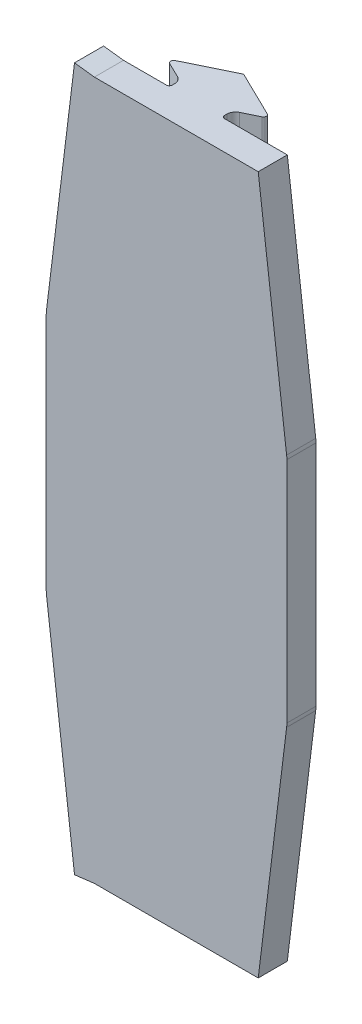
ISO-10303-21;
HEADER;
FILE_DESCRIPTION(('STEP AP214'),'2;1');
FILE_NAME('part.step','',(''),(''),'','','');
FILE_SCHEMA(('AUTOMOTIVE_DESIGN { 1 0 10303 214 1 1 1 1 }'));
ENDSEC;
DATA;
#1=APPLICATION_CONTEXT('core data for automotive mechanical design processes');
#2=APPLICATION_PROTOCOL_DEFINITION('international standard','automotive_design',2000,#1);
#3=PRODUCT_CONTEXT('',#1,'mechanical');
#4=PRODUCT('Part','Part','',(#3));
#5=PRODUCT_RELATED_PRODUCT_CATEGORY('part','',(#4));
#6=PRODUCT_DEFINITION_FORMATION('','',#4);
#7=PRODUCT_DEFINITION_CONTEXT('part definition',#1,'design');
#8=PRODUCT_DEFINITION('design','',#6,#7);
#9=PRODUCT_DEFINITION_SHAPE('','',#8);
#10=(LENGTH_UNIT() NAMED_UNIT(*) SI_UNIT(.MILLI.,.METRE.));
#11=(NAMED_UNIT(*) PLANE_ANGLE_UNIT() SI_UNIT($,.RADIAN.));
#12=(NAMED_UNIT(*) SI_UNIT($,.STERADIAN.) SOLID_ANGLE_UNIT());
#13=UNCERTAINTY_MEASURE_WITH_UNIT(LENGTH_MEASURE(1.E-05),#10,'distance_accuracy_value','');
#14=(GEOMETRIC_REPRESENTATION_CONTEXT(3) GLOBAL_UNCERTAINTY_ASSIGNED_CONTEXT((#13)) GLOBAL_UNIT_ASSIGNED_CONTEXT((#10,
#11,#12)) REPRESENTATION_CONTEXT('',''));
#15=CARTESIAN_POINT('',(0.,0.,0.));
#16=DIRECTION('',(0.,0.,1.));
#17=DIRECTION('',(1.,0.,0.));
#18=AXIS2_PLACEMENT_3D('',#15,#16,#17);
#19=CARTESIAN_POINT('',(-2.10000000000003,24.,3.81226741143411));
#20=DIRECTION('',(0.,1.,0.));
#21=DIRECTION('',(1.,0.,0.));
#22=AXIS2_PLACEMENT_3D('',#19,#20,#21);
#23=PLANE('',#22);
#24=DIRECTION('',(-1.,0.,0.));
#25=VECTOR('',#24,1.);
#26=CARTESIAN_POINT('',(4.20850400580181,24.,5.57546517713166));
#27=LINE('',#26,#25);
#28=CARTESIAN_POINT('',(-4.1,24.,5.57546517713171));
#29=VERTEX_POINT('',#28);
#30=CARTESIAN_POINT('',(-7.05317053833031,24.,5.57546517713172));
#31=VERTEX_POINT('',#30);
#32=EDGE_CURVE('E389',#29,#31,#27,.T.);
#33=ORIENTED_EDGE('',*,*,#32,.T.);
#34=DIRECTION('',(0.,0.,1.));
#35=VECTOR('',#34,1.);
#36=CARTESIAN_POINT('',(-7.05317053833031,24.,5.57546517713172));
#37=LINE('',#36,#35);
#38=CARTESIAN_POINT('',(-7.0531705383303,24.,7.57546517713172));
#39=VERTEX_POINT('',#38);
#40=EDGE_CURVE('E27',#31,#39,#37,.T.);
#41=ORIENTED_EDGE('',*,*,#40,.T.);
#42=DIRECTION('',(-1.,0.,0.));
#43=VECTOR('',#42,1.);
#44=CARTESIAN_POINT('',(4.20850400580182,24.,7.57546517713166));
#45=LINE('',#44,#43);
#46=CARTESIAN_POINT('',(4.20850400580182,24.,7.57546517713166));
#47=VERTEX_POINT('',#46);
#48=EDGE_CURVE('E11',#47,#39,#45,.T.);
#49=ORIENTED_EDGE('',*,*,#48,.F.);
#50=DIRECTION('',(0.,0.,1.));
#51=VECTOR('',#50,1.);
#52=CARTESIAN_POINT('',(4.20850400580181,24.,5.57546517713166));
#53=LINE('',#52,#51);
#54=CARTESIAN_POINT('',(4.20850400580181,24.,5.57546517713166));
#55=VERTEX_POINT('',#54);
#56=EDGE_CURVE('E255',#55,#47,#53,.T.);
#57=ORIENTED_EDGE('',*,*,#56,.F.);
#58=DIRECTION('',(-1.,0.,0.));
#59=VECTOR('',#58,1.);
#60=CARTESIAN_POINT('',(-1.20000000000003,24.,5.5754651771317));
#61=LINE('',#60,#59);
#62=CARTESIAN_POINT('',(-0.100000000000027,24.,5.5754651771317));
#63=VERTEX_POINT('',#62);
#64=EDGE_CURVE('E269',#55,#63,#61,.T.);
#65=ORIENTED_EDGE('',*,*,#64,.T.);
#66=CARTESIAN_POINT('',(-0.100000000000028,24.,5.37546517713168));
#67=DIRECTION('',(0.,1.,0.));
#68=DIRECTION('',(-0.707106781186545,0.,0.70710678118655));
#69=AXIS2_PLACEMENT_3D('',#66,#67,#68);
#70=CIRCLE('',#69,0.2);
#71=CARTESIAN_POINT('',(-0.300000000000028,24.,5.37546517713168));
#72=VERTEX_POINT('',#71);
#73=EDGE_CURVE('E459',#72,#63,#70,.T.);
#74=ORIENTED_EDGE('',*,*,#73,.F.);
#75=DIRECTION('',(0.,0.,-1.));
#76=VECTOR('',#75,1.);
#77=CARTESIAN_POINT('',(-0.30000000000003,24.,4.51884016466477));
#78=LINE('',#77,#76);
#79=CARTESIAN_POINT('',(-0.300000000000028,24.,5.22541291789543));
#80=VERTEX_POINT('',#79);
#81=EDGE_CURVE('E426',#72,#80,#78,.T.);
#82=ORIENTED_EDGE('',*,*,#81,.T.);
#83=CARTESIAN_POINT('',(0.299999999999972,24.,5.22541291789543));
#84=DIRECTION('',(0.,-1.,0.));
#85=DIRECTION('',(-1.,0.,0.));
#86=AXIS2_PLACEMENT_3D('',#83,#84,#85);
#87=CIRCLE('',#86,0.6);
#88=CARTESIAN_POINT('',(0.036977311926528,24.,4.68613649011593));
#89=VERTEX_POINT('',#88);
#90=EDGE_CURVE('E289',#80,#89,#87,.T.);
#91=ORIENTED_EDGE('',*,*,#90,.T.);
#92=DIRECTION('',(0.898794046299169,0.,-0.438371146789073));
#93=VECTOR('',#92,1.);
#94=CARTESIAN_POINT('',(-0.134912057218582,24.,4.76997253707602));
#95=LINE('',#94,#93);
#96=CARTESIAN_POINT('',(1.07520541627584,24.,4.17975880925981));
#97=VERTEX_POINT('',#96);
#98=EDGE_CURVE('E385',#89,#97,#95,.T.);
#99=ORIENTED_EDGE('',*,*,#98,.T.);
#100=CARTESIAN_POINT('',(0.987531186918028,24.,4.));
#101=DIRECTION('',(0.,1.,0.));
#102=DIRECTION('',(0.438371146789087,0.,-0.898794046299162));
#103=AXIS2_PLACEMENT_3D('',#100,#101,#102);
#104=CIRCLE('',#103,0.2);
#105=CARTESIAN_POINT('',(1.07520541627585,24.,3.82024119074015));
#106=VERTEX_POINT('',#105);
#107=EDGE_CURVE('E360',#97,#106,#104,.T.);
#108=ORIENTED_EDGE('',*,*,#107,.T.);
#109=DIRECTION('',(-0.898794046299165,0.,-0.438371146789081));
#110=VECTOR('',#109,1.);
#111=CARTESIAN_POINT('',(-1.79648241465268,24.,2.41962545140828));
#112=LINE('',#111,#110);
#113=CARTESIAN_POINT('',(-2.10000000000004,24.,2.27159003383155));
#114=VERTEX_POINT('',#113);
#115=EDGE_CURVE('E356',#106,#114,#112,.T.);
#116=ORIENTED_EDGE('',*,*,#115,.T.);
#117=DIRECTION('',(-0.898794046299163,0.,0.438371146789086));
#118=VECTOR('',#117,1.);
#119=CARTESIAN_POINT('',(-3.99112029348533,24.,3.19395102986258));
#120=LINE('',#119,#118);
#121=CARTESIAN_POINT('',(-5.27520541627591,24.,3.82024119074016));
#122=VERTEX_POINT('',#121);
#123=EDGE_CURVE('E344',#114,#122,#120,.T.);
#124=ORIENTED_EDGE('',*,*,#123,.T.);
#125=CARTESIAN_POINT('',(-5.18753118691809,24.,4.));
#126=DIRECTION('',(0.,1.,0.));
#127=DIRECTION('',(-0.438371146789068,0.,0.898794046299172));
#128=AXIS2_PLACEMENT_3D('',#125,#126,#127);
#129=CIRCLE('',#128,0.2);
#130=CARTESIAN_POINT('',(-5.2752054162759,24.,4.17975880925983));
#131=VERTEX_POINT('',#130);
#132=EDGE_CURVE('E326',#122,#131,#129,.T.);
#133=ORIENTED_EDGE('',*,*,#132,.T.);
#134=DIRECTION('',(0.89879404629917,0.,0.438371146789071));
#135=VECTOR('',#134,1.);
#136=CARTESIAN_POINT('',(-3.54597389060682,24.,5.02316137750409));
#137=LINE('',#136,#135);
#138=CARTESIAN_POINT('',(-4.23697731192659,24.,4.68613649011594));
#139=VERTEX_POINT('',#138);
#140=EDGE_CURVE('E318',#131,#139,#137,.T.);
#141=ORIENTED_EDGE('',*,*,#140,.T.);
#142=CARTESIAN_POINT('',(-4.5,24.,5.22541291789544));
#143=DIRECTION('',(0.,-1.,0.));
#144=DIRECTION('',(0.438371146789072,0.,-0.89879404629917));
#145=AXIS2_PLACEMENT_3D('',#142,#143,#144);
#146=CIRCLE('',#145,0.6);
#147=CARTESIAN_POINT('',(-3.9,24.,5.22541291789544));
#148=VERTEX_POINT('',#147);
#149=EDGE_CURVE('E308',#139,#148,#146,.T.);
#150=ORIENTED_EDGE('',*,*,#149,.T.);
#151=DIRECTION('',(0.,0.,1.));
#152=VECTOR('',#151,1.);
#153=CARTESIAN_POINT('',(-3.9,24.,4.69386629428291));
#154=LINE('',#153,#152);
#155=CARTESIAN_POINT('',(-3.9,24.,5.37546517713171));
#156=VERTEX_POINT('',#155);
#157=EDGE_CURVE('E290',#148,#156,#154,.T.);
#158=ORIENTED_EDGE('',*,*,#157,.T.);
#159=CARTESIAN_POINT('',(-4.1,24.,5.37546517713171));
#160=DIRECTION('',(0.,1.,0.));
#161=DIRECTION('',(0.707106781186548,0.,0.707106781186548));
#162=AXIS2_PLACEMENT_3D('',#159,#160,#161);
#163=CIRCLE('',#162,0.2);
#164=EDGE_CURVE('E414',#29,#156,#163,.T.);
#165=ORIENTED_EDGE('',*,*,#164,.F.);
#166=EDGE_LOOP('',(#33,#41,#49,#57,#65,#74,#82,#91,#99,#108,#116,#124,#133,#141,#150,#158,#165));
#167=FACE_BOUND('',#166,.T.);
#168=ADVANCED_FACE('F17',(#167),#23,.T.);
#169=CARTESIAN_POINT('',(-2.1,0.,7.5754651771317));
#170=DIRECTION('',(0.,0.,1.));
#171=DIRECTION('',(1.,0.,0.));
#172=AXIS2_PLACEMENT_3D('',#169,#170,#171);
#173=PLANE('',#172);
#174=DIRECTION('',(-0.992546151641321,0.121869343405153,0.));
#175=VECTOR('',#174,1.);
#176=CARTESIAN_POINT('',(-7.0531705383303,24.,7.57546517713172));
#177=LINE('',#176,#175);
#178=CARTESIAN_POINT('',(-8.4194472193632,24.1677576823526,7.57546517713173));
#179=VERTEX_POINT('',#178);
#180=EDGE_CURVE('E187',#39,#179,#177,.T.);
#181=ORIENTED_EDGE('',*,*,#180,.T.);
#182=DIRECTION('',(-0.121869343405147,-0.992546151641322,0.));
#183=VECTOR('',#182,1.);
#184=CARTESIAN_POINT('',(-8.4194472193632,24.1677576823526,7.57546517713173));
#185=LINE('',#184,#183);
#186=CARTESIAN_POINT('',(-10.3290074392395,8.61563772660064,7.57546517713174));
#187=VERTEX_POINT('',#186);
#188=EDGE_CURVE('E20',#179,#187,#185,.T.);
#189=ORIENTED_EDGE('',*,*,#188,.T.);
#190=CARTESIAN_POINT('',(-3.99999999999904,7.83853332722232,7.57546517713171));
#191=DIRECTION('',(0.,0.,1.));
#192=DIRECTION('',(-0.992546151641323,0.121869343405142,0.));
#193=AXIS2_PLACEMENT_3D('',#190,#191,#192);
#194=CIRCLE('',#193,6.37653718043691);
#195=CARTESIAN_POINT('',(-10.376537180436,7.8385333272224,7.57546517713174));
#196=VERTEX_POINT('',#195);
#197=EDGE_CURVE('E184',#187,#196,#194,.T.);
#198=ORIENTED_EDGE('',*,*,#197,.T.);
#199=DIRECTION('',(0.,-1.,0.));
#200=VECTOR('',#199,1.);
#201=CARTESIAN_POINT('',(-10.376537180436,7.8385333272224,7.57546517713174));
#202=LINE('',#201,#200);
#203=CARTESIAN_POINT('',(-10.376537180436,-7.83853332722238,7.57546517713174));
#204=VERTEX_POINT('',#203);
#205=EDGE_CURVE('E212',#196,#204,#202,.T.);
#206=ORIENTED_EDGE('',*,*,#205,.T.);
#207=CARTESIAN_POINT('',(-4.00000000000044,-7.83853332722241,7.57546517713171));
#208=DIRECTION('',(0.,0.,1.));
#209=DIRECTION('',(-1.,0.,0.));
#210=AXIS2_PLACEMENT_3D('',#207,#208,#209);
#211=CIRCLE('',#210,6.37653718043552);
#212=CARTESIAN_POINT('',(-10.3290074392395,-8.61563772660061,7.57546517713174));
#213=VERTEX_POINT('',#212);
#214=EDGE_CURVE('E221',#204,#213,#211,.T.);
#215=ORIENTED_EDGE('',*,*,#214,.T.);
#216=DIRECTION('',(0.121869343405148,-0.992546151641322,0.));
#217=VECTOR('',#216,1.);
#218=CARTESIAN_POINT('',(-10.3290074392395,-8.61563772660062,7.57546517713174));
#219=LINE('',#218,#217);
#220=CARTESIAN_POINT('',(-8.4194472193632,-24.1677576823526,7.57546517713173));
#221=VERTEX_POINT('',#220);
#222=EDGE_CURVE('E222',#213,#221,#219,.T.);
#223=ORIENTED_EDGE('',*,*,#222,.T.);
#224=DIRECTION('',(0.992546151641322,0.121869343405146,0.));
#225=VECTOR('',#224,1.);
#226=CARTESIAN_POINT('',(-8.4194472193632,-24.1677576823526,7.57546517713173));
#227=LINE('',#226,#225);
#228=CARTESIAN_POINT('',(-7.0531705383303,-24.,7.57546517713172));
#229=VERTEX_POINT('',#228);
#230=EDGE_CURVE('E228',#221,#229,#227,.T.);
#231=ORIENTED_EDGE('',*,*,#230,.T.);
#232=DIRECTION('',(1.,0.,0.));
#233=VECTOR('',#232,1.);
#234=CARTESIAN_POINT('',(-7.0531705383303,-24.,7.57546517713172));
#235=LINE('',#234,#233);
#236=CARTESIAN_POINT('',(4.20850400580179,-24.,7.57546517713166));
#237=VERTEX_POINT('',#236);
#238=EDGE_CURVE('E275',#229,#237,#235,.T.);
#239=ORIENTED_EDGE('',*,*,#238,.T.);
#240=DIRECTION('',(0.121869343405148,0.992546151641322,0.));
#241=VECTOR('',#240,1.);
#242=CARTESIAN_POINT('',(4.20850400580179,-24.,7.57546517713166));
#243=LINE('',#242,#241);
#244=CARTESIAN_POINT('',(6.16031360234597,-8.10378648429901,7.57546517713165));
#245=VERTEX_POINT('',#244);
#246=EDGE_CURVE('E231',#237,#245,#243,.T.);
#247=ORIENTED_EDGE('',*,*,#246,.T.);
#248=CARTESIAN_POINT('',(4.00000000000007,-7.83853332722238,7.57546517713166));
#249=DIRECTION('',(0.,0.,1.));
#250=DIRECTION('',(0.992546151641321,-0.121869343405155,0.));
#251=AXIS2_PLACEMENT_3D('',#248,#249,#250);
#252=CIRCLE('',#251,2.17653718043589);
#253=CARTESIAN_POINT('',(6.17653718043596,-7.83853332722238,7.57546517713165));
#254=VERTEX_POINT('',#253);
#255=EDGE_CURVE('E232',#245,#254,#252,.T.);
#256=ORIENTED_EDGE('',*,*,#255,.T.);
#257=DIRECTION('',(0.,1.,0.));
#258=VECTOR('',#257,1.);
#259=CARTESIAN_POINT('',(6.17653718043596,-7.83853332722238,7.57546517713165));
#260=LINE('',#259,#258);
#261=CARTESIAN_POINT('',(6.17653718043597,7.83853332722239,7.57546517713165));
#262=VERTEX_POINT('',#261);
#263=EDGE_CURVE('E240',#254,#262,#260,.T.);
#264=ORIENTED_EDGE('',*,*,#263,.T.);
#265=CARTESIAN_POINT('',(4.,7.83853332722239,7.57546517713166));
#266=DIRECTION('',(0.,0.,1.));
#267=DIRECTION('',(1.,0.,0.));
#268=AXIS2_PLACEMENT_3D('',#265,#266,#267);
#269=CIRCLE('',#268,2.17653718043596);
#270=CARTESIAN_POINT('',(6.16031360234597,8.10378648429902,7.57546517713165));
#271=VERTEX_POINT('',#270);
#272=EDGE_CURVE('E247',#262,#271,#269,.T.);
#273=ORIENTED_EDGE('',*,*,#272,.T.);
#274=DIRECTION('',(-0.121869343405148,0.992546151641322,0.));
#275=VECTOR('',#274,1.);
#276=CARTESIAN_POINT('',(6.16031360234597,8.10378648429902,7.57546517713165));
#277=LINE('',#276,#275);
#278=EDGE_CURVE('E254',#271,#47,#277,.T.);
#279=ORIENTED_EDGE('',*,*,#278,.T.);
#280=ORIENTED_EDGE('',*,*,#48,.T.);
#281=EDGE_LOOP('',(#181,#189,#198,#206,#215,#223,#231,#239,#247,#256,#264,#273,#279,#280));
#282=FACE_BOUND('',#281,.T.);
#283=ADVANCED_FACE('F182',(#282),#173,.T.);
#284=CARTESIAN_POINT('',(-7.05317053833031,24.,5.57546517713172));
#285=DIRECTION('',(0.121869343405153,0.992546151641321,0.));
#286=DIRECTION('',(0.,0.,-1.));
#287=AXIS2_PLACEMENT_3D('',#284,#285,#286);
#288=PLANE('',#287);
#289=DIRECTION('',(-0.992546151641321,0.121869343405153,0.));
#290=VECTOR('',#289,1.);
#291=CARTESIAN_POINT('',(-7.05317053833031,24.,5.57546517713172));
#292=LINE('',#291,#290);
#293=CARTESIAN_POINT('',(-8.41944721936321,24.1677576823526,5.57546517713173));
#294=VERTEX_POINT('',#293);
#295=EDGE_CURVE('E396',#31,#294,#292,.T.);
#296=ORIENTED_EDGE('',*,*,#295,.T.);
#297=DIRECTION('',(0.,0.,1.));
#298=VECTOR('',#297,1.);
#299=CARTESIAN_POINT('',(-8.41944721936321,24.1677576823526,5.57546517713173));
#300=LINE('',#299,#298);
#301=EDGE_CURVE('E191',#294,#179,#300,.T.);
#302=ORIENTED_EDGE('',*,*,#301,.T.);
#303=ORIENTED_EDGE('',*,*,#180,.F.);
#304=ORIENTED_EDGE('',*,*,#40,.F.);
#305=EDGE_LOOP('',(#296,#302,#303,#304));
#306=FACE_BOUND('',#305,.T.);
#307=ADVANCED_FACE('F605',(#306),#288,.T.);
#308=CARTESIAN_POINT('',(-8.41944721936321,24.1677576823526,5.57546517713173));
#309=DIRECTION('',(-0.992546151641322,0.121869343405147,0.));
#310=DIRECTION('',(0.,0.,1.));
#311=AXIS2_PLACEMENT_3D('',#308,#309,#310);
#312=PLANE('',#311);
#313=DIRECTION('',(-0.121869343405147,-0.992546151641322,0.));
#314=VECTOR('',#313,1.);
#315=CARTESIAN_POINT('',(-8.41944721936321,24.1677576823526,5.57546517713173));
#316=LINE('',#315,#314);
#317=CARTESIAN_POINT('',(-10.3290074392395,8.61563772660064,5.57546517713174));
#318=VERTEX_POINT('',#317);
#319=EDGE_CURVE('E197',#294,#318,#316,.T.);
#320=ORIENTED_EDGE('',*,*,#319,.T.);
#321=DIRECTION('',(0.,0.,1.));
#322=VECTOR('',#321,1.);
#323=CARTESIAN_POINT('',(-10.3290074392395,8.61563772660064,5.57546517713174));
#324=LINE('',#323,#322);
#325=EDGE_CURVE('E192',#318,#187,#324,.T.);
#326=ORIENTED_EDGE('',*,*,#325,.T.);
#327=ORIENTED_EDGE('',*,*,#188,.F.);
#328=ORIENTED_EDGE('',*,*,#301,.F.);
#329=EDGE_LOOP('',(#320,#326,#327,#328));
#330=FACE_BOUND('',#329,.T.);
#331=ADVANCED_FACE('F195',(#330),#312,.T.);
#332=CARTESIAN_POINT('',(-3.99999999999905,7.83853332722232,5.57546517713171));
#333=DIRECTION('',(0.,0.,1.));
#334=DIRECTION('',(-0.992546151641323,0.121869343405142,0.));
#335=AXIS2_PLACEMENT_3D('',#332,#333,#334);
#336=CYLINDRICAL_SURFACE('',#335,6.37653718043691);
#337=CARTESIAN_POINT('',(-3.99999999999905,7.83853332722232,5.57546517713171));
#338=DIRECTION('',(0.,0.,1.));
#339=DIRECTION('',(-0.992546151641323,0.121869343405142,0.));
#340=AXIS2_PLACEMENT_3D('',#337,#338,#339);
#341=CIRCLE('',#340,6.37653718043691);
#342=CARTESIAN_POINT('',(-10.376537180436,7.8385333272224,5.57546517713174));
#343=VERTEX_POINT('',#342);
#344=EDGE_CURVE('E400',#318,#343,#341,.T.);
#345=ORIENTED_EDGE('',*,*,#344,.T.);
#346=DIRECTION('',(0.,0.,1.));
#347=VECTOR('',#346,1.);
#348=CARTESIAN_POINT('',(-10.376537180436,7.8385333272224,5.57546517713174));
#349=LINE('',#348,#347);
#350=EDGE_CURVE('E205',#343,#196,#349,.T.);
#351=ORIENTED_EDGE('',*,*,#350,.T.);
#352=ORIENTED_EDGE('',*,*,#197,.F.);
#353=ORIENTED_EDGE('',*,*,#325,.F.);
#354=EDGE_LOOP('',(#345,#351,#352,#353));
#355=FACE_BOUND('',#354,.T.);
#356=ADVANCED_FACE('F203',(#355),#336,.T.);
#357=CARTESIAN_POINT('',(-10.376537180436,7.8385333272224,5.57546517713174));
#358=DIRECTION('',(-1.,0.,0.));
#359=DIRECTION('',(0.,1.,0.));
#360=AXIS2_PLACEMENT_3D('',#357,#358,#359);
#361=PLANE('',#360);
#362=DIRECTION('',(0.,-1.,0.));
#363=VECTOR('',#362,1.);
#364=CARTESIAN_POINT('',(-10.376537180436,7.8385333272224,5.57546517713174));
#365=LINE('',#364,#363);
#366=CARTESIAN_POINT('',(-10.376537180436,-7.83853332722238,5.57546517713174));
#367=VERTEX_POINT('',#366);
#368=EDGE_CURVE('E403',#343,#367,#365,.T.);
#369=ORIENTED_EDGE('',*,*,#368,.T.);
#370=DIRECTION('',(0.,0.,1.));
#371=VECTOR('',#370,1.);
#372=CARTESIAN_POINT('',(-10.376537180436,-7.83853332722238,5.57546517713174));
#373=LINE('',#372,#371);
#374=EDGE_CURVE('E217',#367,#204,#373,.T.);
#375=ORIENTED_EDGE('',*,*,#374,.T.);
#376=ORIENTED_EDGE('',*,*,#205,.F.);
#377=ORIENTED_EDGE('',*,*,#350,.F.);
#378=EDGE_LOOP('',(#369,#375,#376,#377));
#379=FACE_BOUND('',#378,.T.);
#380=ADVANCED_FACE('F611',(#379),#361,.T.);
#381=CARTESIAN_POINT('',(-4.00000000000045,-7.83853332722241,5.57546517713171));
#382=DIRECTION('',(0.,0.,1.));
#383=DIRECTION('',(-1.,0.,0.));
#384=AXIS2_PLACEMENT_3D('',#381,#382,#383);
#385=CYLINDRICAL_SURFACE('',#384,6.37653718043552);
#386=CARTESIAN_POINT('',(-4.00000000000045,-7.83853332722241,5.57546517713171));
#387=DIRECTION('',(0.,0.,1.));
#388=DIRECTION('',(-1.,0.,0.));
#389=AXIS2_PLACEMENT_3D('',#386,#387,#388);
#390=CIRCLE('',#389,6.37653718043552);
#391=CARTESIAN_POINT('',(-10.3290074392395,-8.61563772660061,5.57546517713174));
#392=VERTEX_POINT('',#391);
#393=EDGE_CURVE('E407',#367,#392,#390,.T.);
#394=ORIENTED_EDGE('',*,*,#393,.T.);
#395=DIRECTION('',(0.,0.,1.));
#396=VECTOR('',#395,1.);
#397=CARTESIAN_POINT('',(-10.3290074392395,-8.61563772660061,5.57546517713174));
#398=LINE('',#397,#396);
#399=EDGE_CURVE('E225',#392,#213,#398,.T.);
#400=ORIENTED_EDGE('',*,*,#399,.T.);
#401=ORIENTED_EDGE('',*,*,#214,.F.);
#402=ORIENTED_EDGE('',*,*,#374,.F.);
#403=EDGE_LOOP('',(#394,#400,#401,#402));
#404=FACE_BOUND('',#403,.T.);
#405=ADVANCED_FACE('F612',(#404),#385,.T.);
#406=CARTESIAN_POINT('',(-10.3290074392395,-8.61563772660062,5.57546517713174));
#407=DIRECTION('',(-0.992546151641322,-0.121869343405148,0.));
#408=DIRECTION('',(-0.121869343405148,0.992546151641322,0.));
#409=AXIS2_PLACEMENT_3D('',#406,#407,#408);
#410=PLANE('',#409);
#411=DIRECTION('',(0.121869343405148,-0.992546151641322,0.));
#412=VECTOR('',#411,1.);
#413=CARTESIAN_POINT('',(-10.3290074392395,-8.61563772660062,5.57546517713174));
#414=LINE('',#413,#412);
#415=CARTESIAN_POINT('',(-8.41944721936321,-24.1677576823526,5.57546517713173));
#416=VERTEX_POINT('',#415);
#417=EDGE_CURVE('E411',#392,#416,#414,.T.);
#418=ORIENTED_EDGE('',*,*,#417,.T.);
#419=DIRECTION('',(0.,0.,1.));
#420=VECTOR('',#419,1.);
#421=CARTESIAN_POINT('',(-8.41944721936321,-24.1677576823526,5.57546517713173));
#422=LINE('',#421,#420);
#423=EDGE_CURVE('E226',#416,#221,#422,.T.);
#424=ORIENTED_EDGE('',*,*,#423,.T.);
#425=ORIENTED_EDGE('',*,*,#222,.F.);
#426=ORIENTED_EDGE('',*,*,#399,.F.);
#427=EDGE_LOOP('',(#418,#424,#425,#426));
#428=FACE_BOUND('',#427,.T.);
#429=ADVANCED_FACE('F579',(#428),#410,.T.);
#430=CARTESIAN_POINT('',(-8.41944721936321,-24.1677576823526,5.57546517713173));
#431=DIRECTION('',(0.121869343405146,-0.992546151641322,0.));
#432=DIRECTION('',(0.,0.,-1.));
#433=AXIS2_PLACEMENT_3D('',#430,#431,#432);
#434=PLANE('',#433);
#435=DIRECTION('',(0.992546151641322,0.121869343405146,0.));
#436=VECTOR('',#435,1.);
#437=CARTESIAN_POINT('',(-8.41944721936321,-24.1677576823526,5.57546517713173));
#438=LINE('',#437,#436);
#439=CARTESIAN_POINT('',(-7.05317053833031,-24.,5.57546517713172));
#440=VERTEX_POINT('',#439);
#441=EDGE_CURVE('E447',#416,#440,#438,.T.);
#442=ORIENTED_EDGE('',*,*,#441,.T.);
#443=DIRECTION('',(0.,0.,1.));
#444=VECTOR('',#443,1.);
#445=CARTESIAN_POINT('',(-7.05317053833031,-24.,5.57546517713172));
#446=LINE('',#445,#444);
#447=EDGE_CURVE('E274',#440,#229,#446,.T.);
#448=ORIENTED_EDGE('',*,*,#447,.T.);
#449=ORIENTED_EDGE('',*,*,#230,.F.);
#450=ORIENTED_EDGE('',*,*,#423,.F.);
#451=EDGE_LOOP('',(#442,#448,#449,#450));
#452=FACE_BOUND('',#451,.T.);
#453=ADVANCED_FACE('F583',(#452),#434,.T.);
#454=CARTESIAN_POINT('',(4.20850400580178,-24.,5.57546517713166));
#455=DIRECTION('',(0.992546151641322,-0.121869343405148,0.));
#456=DIRECTION('',(0.,0.,-1.));
#457=AXIS2_PLACEMENT_3D('',#454,#455,#456);
#458=PLANE('',#457);
#459=DIRECTION('',(0.121869343405148,0.992546151641322,0.));
#460=VECTOR('',#459,1.);
#461=CARTESIAN_POINT('',(4.20850400580178,-24.,5.57546517713166));
#462=LINE('',#461,#460);
#463=CARTESIAN_POINT('',(4.20850400580178,-24.,5.57546517713166));
#464=VERTEX_POINT('',#463);
#465=CARTESIAN_POINT('',(6.16031360234596,-8.10378648429901,5.57546517713165));
#466=VERTEX_POINT('',#465);
#467=EDGE_CURVE('E259',#464,#466,#462,.T.);
#468=ORIENTED_EDGE('',*,*,#467,.T.);
#469=DIRECTION('',(0.,0.,1.));
#470=VECTOR('',#469,1.);
#471=CARTESIAN_POINT('',(6.16031360234596,-8.10378648429901,5.57546517713165));
#472=LINE('',#471,#470);
#473=EDGE_CURVE('E235',#466,#245,#472,.T.);
#474=ORIENTED_EDGE('',*,*,#473,.T.);
#475=ORIENTED_EDGE('',*,*,#246,.F.);
#476=DIRECTION('',(0.,0.,1.));
#477=VECTOR('',#476,1.);
#478=CARTESIAN_POINT('',(4.20850400580178,-24.,5.57546517713166));
#479=LINE('',#478,#477);
#480=EDGE_CURVE('E279',#464,#237,#479,.T.);
#481=ORIENTED_EDGE('',*,*,#480,.F.);
#482=EDGE_LOOP('',(#468,#474,#475,#481));
#483=FACE_BOUND('',#482,.T.);
#484=ADVANCED_FACE('F587',(#483),#458,.T.);
#485=CARTESIAN_POINT('',(4.00000000000006,-7.83853332722238,5.57546517713166));
#486=DIRECTION('',(0.,0.,1.));
#487=DIRECTION('',(0.992546151641321,-0.121869343405155,0.));
#488=AXIS2_PLACEMENT_3D('',#485,#486,#487);
#489=CYLINDRICAL_SURFACE('',#488,2.17653718043589);
#490=CARTESIAN_POINT('',(4.00000000000006,-7.83853332722238,5.57546517713166));
#491=DIRECTION('',(0.,0.,1.));
#492=DIRECTION('',(0.992546151641321,-0.121869343405155,0.));
#493=AXIS2_PLACEMENT_3D('',#490,#491,#492);
#494=CIRCLE('',#493,2.17653718043589);
#495=CARTESIAN_POINT('',(6.17653718043595,-7.83853332722238,5.57546517713165));
#496=VERTEX_POINT('',#495);
#497=EDGE_CURVE('E260',#466,#496,#494,.T.);
#498=ORIENTED_EDGE('',*,*,#497,.T.);
#499=DIRECTION('',(0.,0.,1.));
#500=VECTOR('',#499,1.);
#501=CARTESIAN_POINT('',(6.17653718043595,-7.83853332722238,5.57546517713165));
#502=LINE('',#501,#500);
#503=EDGE_CURVE('E236',#496,#254,#502,.T.);
#504=ORIENTED_EDGE('',*,*,#503,.T.);
#505=ORIENTED_EDGE('',*,*,#255,.F.);
#506=ORIENTED_EDGE('',*,*,#473,.F.);
#507=EDGE_LOOP('',(#498,#504,#505,#506));
#508=FACE_BOUND('',#507,.T.);
#509=ADVANCED_FACE('F589',(#508),#489,.T.);
#510=CARTESIAN_POINT('',(6.17653718043595,-7.83853332722238,5.57546517713165));
#511=DIRECTION('',(1.,0.,0.));
#512=DIRECTION('',(0.,0.,-1.));
#513=AXIS2_PLACEMENT_3D('',#510,#511,#512);
#514=PLANE('',#513);
#515=DIRECTION('',(0.,1.,0.));
#516=VECTOR('',#515,1.);
#517=CARTESIAN_POINT('',(6.17653718043595,-7.83853332722238,5.57546517713165));
#518=LINE('',#517,#516);
#519=CARTESIAN_POINT('',(6.17653718043596,7.83853332722239,5.57546517713165));
#520=VERTEX_POINT('',#519);
#521=EDGE_CURVE('E264',#496,#520,#518,.T.);
#522=ORIENTED_EDGE('',*,*,#521,.T.);
#523=DIRECTION('',(0.,0.,1.));
#524=VECTOR('',#523,1.);
#525=CARTESIAN_POINT('',(6.17653718043596,7.83853332722239,5.57546517713165));
#526=LINE('',#525,#524);
#527=EDGE_CURVE('E243',#520,#262,#526,.T.);
#528=ORIENTED_EDGE('',*,*,#527,.T.);
#529=ORIENTED_EDGE('',*,*,#263,.F.);
#530=ORIENTED_EDGE('',*,*,#503,.F.);
#531=EDGE_LOOP('',(#522,#528,#529,#530));
#532=FACE_BOUND('',#531,.T.);
#533=ADVANCED_FACE('F593',(#532),#514,.T.);
#534=CARTESIAN_POINT('',(4.,7.83853332722239,5.57546517713166));
#535=DIRECTION('',(0.,0.,1.));
#536=DIRECTION('',(1.,0.,0.));
#537=AXIS2_PLACEMENT_3D('',#534,#535,#536);
#538=CYLINDRICAL_SURFACE('',#537,2.17653718043596);
#539=CARTESIAN_POINT('',(4.,7.83853332722239,5.57546517713166));
#540=DIRECTION('',(0.,0.,1.));
#541=DIRECTION('',(1.,0.,0.));
#542=AXIS2_PLACEMENT_3D('',#539,#540,#541);
#543=CIRCLE('',#542,2.17653718043596);
#544=CARTESIAN_POINT('',(6.16031360234596,8.10378648429902,5.57546517713165));
#545=VERTEX_POINT('',#544);
#546=EDGE_CURVE('E268',#520,#545,#543,.T.);
#547=ORIENTED_EDGE('',*,*,#546,.T.);
#548=DIRECTION('',(0.,0.,1.));
#549=VECTOR('',#548,1.);
#550=CARTESIAN_POINT('',(6.16031360234596,8.10378648429902,5.57546517713165));
#551=LINE('',#550,#549);
#552=EDGE_CURVE('E250',#545,#271,#551,.T.);
#553=ORIENTED_EDGE('',*,*,#552,.T.);
#554=ORIENTED_EDGE('',*,*,#272,.F.);
#555=ORIENTED_EDGE('',*,*,#527,.F.);
#556=EDGE_LOOP('',(#547,#553,#554,#555));
#557=FACE_BOUND('',#556,.T.);
#558=ADVANCED_FACE('F597',(#557),#538,.T.);
#559=CARTESIAN_POINT('',(6.16031360234596,8.10378648429902,5.57546517713165));
#560=DIRECTION('',(0.992546151641322,0.121869343405148,0.));
#561=DIRECTION('',(0.,0.,-1.));
#562=AXIS2_PLACEMENT_3D('',#559,#560,#561);
#563=PLANE('',#562);
#564=DIRECTION('',(-0.121869343405148,0.992546151641322,0.));
#565=VECTOR('',#564,1.);
#566=CARTESIAN_POINT('',(6.16031360234596,8.10378648429902,5.57546517713165));
#567=LINE('',#566,#565);
#568=EDGE_CURVE('E273',#545,#55,#567,.T.);
#569=ORIENTED_EDGE('',*,*,#568,.T.);
#570=ORIENTED_EDGE('',*,*,#56,.T.);
#571=ORIENTED_EDGE('',*,*,#278,.F.);
#572=ORIENTED_EDGE('',*,*,#552,.F.);
#573=EDGE_LOOP('',(#569,#570,#571,#572));
#574=FACE_BOUND('',#573,.T.);
#575=ADVANCED_FACE('F601',(#574),#563,.T.);
#576=CARTESIAN_POINT('',(-2.1,0.,5.57546517713169));
#577=DIRECTION('',(0.,0.,1.));
#578=DIRECTION('',(1.,0.,0.));
#579=AXIS2_PLACEMENT_3D('',#576,#577,#578);
#580=PLANE('',#579);
#581=DIRECTION('',(0.,-1.,0.));
#582=VECTOR('',#581,1.);
#583=CARTESIAN_POINT('',(-0.100000000000027,-12.,5.57546517713168));
#584=LINE('',#583,#582);
#585=CARTESIAN_POINT('',(-0.100000000000027,-24.,5.5754651771317));
#586=VERTEX_POINT('',#585);
#587=EDGE_CURVE('E451',#63,#586,#584,.T.);
#588=ORIENTED_EDGE('',*,*,#587,.F.);
#589=ORIENTED_EDGE('',*,*,#64,.F.);
#590=ORIENTED_EDGE('',*,*,#568,.F.);
#591=ORIENTED_EDGE('',*,*,#546,.F.);
#592=ORIENTED_EDGE('',*,*,#521,.F.);
#593=ORIENTED_EDGE('',*,*,#497,.F.);
#594=ORIENTED_EDGE('',*,*,#467,.F.);
#595=DIRECTION('',(1.,0.,0.));
#596=VECTOR('',#595,1.);
#597=CARTESIAN_POINT('',(-1.20000000000003,-24.,5.5754651771317));
#598=LINE('',#597,#596);
#599=EDGE_CURVE('E285',#586,#464,#598,.T.);
#600=ORIENTED_EDGE('',*,*,#599,.F.);
#601=EDGE_LOOP('',(#588,#589,#590,#591,#592,#593,#594,#600));
#602=FACE_BOUND('',#601,.T.);
#603=ADVANCED_FACE('F504',(#602),#580,.F.);
#604=CARTESIAN_POINT('',(-2.10000000000003,-24.,3.81226741143411));
#605=DIRECTION('',(0.,-1.,0.));
#606=DIRECTION('',(0.,0.,-1.));
#607=AXIS2_PLACEMENT_3D('',#604,#605,#606);
#608=PLANE('',#607);
#609=DIRECTION('',(1.,0.,0.));
#610=VECTOR('',#609,1.);
#611=CARTESIAN_POINT('',(-3.1,-24.,5.5754651771317));
#612=LINE('',#611,#610);
#613=CARTESIAN_POINT('',(-4.1,-24.,5.5754651771317));
#614=VERTEX_POINT('',#613);
#615=EDGE_CURVE('E455',#440,#614,#612,.T.);
#616=ORIENTED_EDGE('',*,*,#615,.T.);
#617=CARTESIAN_POINT('',(-4.1,-24.,5.37546517713171));
#618=DIRECTION('',(0.,-1.,0.));
#619=DIRECTION('',(0.707106781186548,0.,0.707106781186548));
#620=AXIS2_PLACEMENT_3D('',#617,#618,#619);
#621=CIRCLE('',#620,0.2);
#622=CARTESIAN_POINT('',(-3.9,-24.,5.37546517713171));
#623=VERTEX_POINT('',#622);
#624=EDGE_CURVE('E423',#623,#614,#621,.T.);
#625=ORIENTED_EDGE('',*,*,#624,.F.);
#626=DIRECTION('',(0.,0.,-1.));
#627=VECTOR('',#626,1.);
#628=CARTESIAN_POINT('',(-3.9,-24.,4.69386629428291));
#629=LINE('',#628,#627);
#630=CARTESIAN_POINT('',(-3.9,-24.,5.22541291789544));
#631=VERTEX_POINT('',#630);
#632=EDGE_CURVE('E286',#623,#631,#629,.T.);
#633=ORIENTED_EDGE('',*,*,#632,.T.);
#634=CARTESIAN_POINT('',(-4.5,-24.,5.22541291789544));
#635=DIRECTION('',(0.,1.,0.));
#636=DIRECTION('',(0.438371146789072,0.,-0.89879404629917));
#637=AXIS2_PLACEMENT_3D('',#634,#635,#636);
#638=CIRCLE('',#637,0.6);
#639=CARTESIAN_POINT('',(-4.23697731192659,-24.,4.68613649011594));
#640=VERTEX_POINT('',#639);
#641=EDGE_CURVE('E305',#631,#640,#638,.T.);
#642=ORIENTED_EDGE('',*,*,#641,.T.);
#643=DIRECTION('',(-0.89879404629917,0.,-0.438371146789071));
#644=VECTOR('',#643,1.);
#645=CARTESIAN_POINT('',(-3.54597389060682,-24.,5.02316137750409));
#646=LINE('',#645,#644);
#647=CARTESIAN_POINT('',(-5.2752054162759,-24.,4.17975880925983));
#648=VERTEX_POINT('',#647);
#649=EDGE_CURVE('E315',#640,#648,#646,.T.);
#650=ORIENTED_EDGE('',*,*,#649,.T.);
#651=CARTESIAN_POINT('',(-5.18753118691809,-24.,4.));
#652=DIRECTION('',(0.,-1.,0.));
#653=DIRECTION('',(-0.438371146789068,0.,0.898794046299172));
#654=AXIS2_PLACEMENT_3D('',#651,#652,#653);
#655=CIRCLE('',#654,0.2);
#656=CARTESIAN_POINT('',(-5.27520541627591,-24.,3.82024119074016));
#657=VERTEX_POINT('',#656);
#658=EDGE_CURVE('E323',#648,#657,#655,.T.);
#659=ORIENTED_EDGE('',*,*,#658,.T.);
#660=DIRECTION('',(0.898794046299163,0.,-0.438371146789086));
#661=VECTOR('',#660,1.);
#662=CARTESIAN_POINT('',(-3.99112029348533,-24.,3.19395102986258));
#663=LINE('',#662,#661);
#664=CARTESIAN_POINT('',(-2.10000000000004,-24.,2.27159003383155));
#665=VERTEX_POINT('',#664);
#666=EDGE_CURVE('E340',#657,#665,#663,.T.);
#667=ORIENTED_EDGE('',*,*,#666,.T.);
#668=DIRECTION('',(0.898794046299165,0.,0.438371146789081));
#669=VECTOR('',#668,1.);
#670=CARTESIAN_POINT('',(-1.79648241465268,-24.,2.41962545140828));
#671=LINE('',#670,#669);
#672=CARTESIAN_POINT('',(1.07520541627585,-24.,3.82024119074015));
#673=VERTEX_POINT('',#672);
#674=EDGE_CURVE('E349',#665,#673,#671,.T.);
#675=ORIENTED_EDGE('',*,*,#674,.T.);
#676=CARTESIAN_POINT('',(0.987531186918028,-24.,4.));
#677=DIRECTION('',(0.,-1.,0.));
#678=DIRECTION('',(0.438371146789087,0.,-0.898794046299162));
#679=AXIS2_PLACEMENT_3D('',#676,#677,#678);
#680=CIRCLE('',#679,0.2);
#681=CARTESIAN_POINT('',(1.07520541627584,-24.,4.17975880925981));
#682=VERTEX_POINT('',#681);
#683=EDGE_CURVE('E357',#673,#682,#680,.T.);
#684=ORIENTED_EDGE('',*,*,#683,.T.);
#685=DIRECTION('',(-0.898794046299169,0.,0.438371146789073));
#686=VECTOR('',#685,1.);
#687=CARTESIAN_POINT('',(-0.134912057218583,-24.,4.76997253707602));
#688=LINE('',#687,#686);
#689=CARTESIAN_POINT('',(0.036977311926528,-24.,4.68613649011593));
#690=VERTEX_POINT('',#689);
#691=EDGE_CURVE('E372',#682,#690,#688,.T.);
#692=ORIENTED_EDGE('',*,*,#691,.T.);
#693=CARTESIAN_POINT('',(0.299999999999972,-24.,5.22541291789543));
#694=DIRECTION('',(0.,1.,0.));
#695=DIRECTION('',(-1.,0.,0.));
#696=AXIS2_PLACEMENT_3D('',#693,#694,#695);
#697=CIRCLE('',#696,0.6);
#698=CARTESIAN_POINT('',(-0.300000000000028,-24.,5.22541291789543));
#699=VERTEX_POINT('',#698);
#700=EDGE_CURVE('E291',#690,#699,#697,.T.);
#701=ORIENTED_EDGE('',*,*,#700,.T.);
#702=DIRECTION('',(0.,0.,1.));
#703=VECTOR('',#702,1.);
#704=CARTESIAN_POINT('',(-0.30000000000003,-24.,4.51884016466477));
#705=LINE('',#704,#703);
#706=CARTESIAN_POINT('',(-0.300000000000028,-24.,5.37546517713168));
#707=VERTEX_POINT('',#706);
#708=EDGE_CURVE('E434',#699,#707,#705,.T.);
#709=ORIENTED_EDGE('',*,*,#708,.T.);
#710=CARTESIAN_POINT('',(-0.100000000000028,-24.,5.37546517713168));
#711=DIRECTION('',(0.,-1.,0.));
#712=DIRECTION('',(-0.707106781186545,0.,0.70710678118655));
#713=AXIS2_PLACEMENT_3D('',#710,#711,#712);
#714=CIRCLE('',#713,0.2);
#715=EDGE_CURVE('E481',#586,#707,#714,.T.);
#716=ORIENTED_EDGE('',*,*,#715,.F.);
#717=ORIENTED_EDGE('',*,*,#599,.T.);
#718=ORIENTED_EDGE('',*,*,#480,.T.);
#719=ORIENTED_EDGE('',*,*,#238,.F.);
#720=ORIENTED_EDGE('',*,*,#447,.F.);
#721=EDGE_LOOP('',(#616,#625,#633,#642,#650,#659,#667,#675,#684,#692,#701,#709,#716,#717,#718,
#719,#720));
#722=FACE_BOUND('',#721,.T.);
#723=ADVANCED_FACE('F498',(#722),#608,.T.);
#724=CARTESIAN_POINT('',(0.299999999999972,-24.,5.22541291789543));
#725=DIRECTION('',(0.,1.,0.));
#726=DIRECTION('',(-1.,0.,0.));
#727=AXIS2_PLACEMENT_3D('',#724,#725,#726);
#728=CYLINDRICAL_SURFACE('',#727,0.6);
#729=ORIENTED_EDGE('',*,*,#90,.F.);
#730=DIRECTION('',(0.,1.,0.));
#731=VECTOR('',#730,1.);
#732=CARTESIAN_POINT('',(-0.300000000000028,-24.,5.22541291789543));
#733=LINE('',#732,#731);
#734=EDGE_CURVE('E430',#699,#80,#733,.T.);
#735=ORIENTED_EDGE('',*,*,#734,.F.);
#736=ORIENTED_EDGE('',*,*,#700,.F.);
#737=DIRECTION('',(0.,1.,0.));
#738=VECTOR('',#737,1.);
#739=CARTESIAN_POINT('',(0.036977311926528,-24.,4.68613649011593));
#740=LINE('',#739,#738);
#741=EDGE_CURVE('E379',#690,#89,#740,.T.);
#742=ORIENTED_EDGE('',*,*,#741,.T.);
#743=EDGE_LOOP('',(#729,#735,#736,#742));
#744=FACE_BOUND('',#743,.T.);
#745=ADVANCED_FACE('F655',(#744),#728,.F.);
#746=CARTESIAN_POINT('',(-3.9,-24.,5.5754651771317));
#747=DIRECTION('',(1.,0.,0.));
#748=DIRECTION('',(0.,0.,-1.));
#749=AXIS2_PLACEMENT_3D('',#746,#747,#748);
#750=PLANE('',#749);
#751=DIRECTION('',(0.,-1.,0.));
#752=VECTOR('',#751,1.);
#753=CARTESIAN_POINT('',(-3.9,-12.,5.37546517713171));
#754=LINE('',#753,#752);
#755=EDGE_CURVE('E418',#156,#623,#754,.T.);
#756=ORIENTED_EDGE('',*,*,#755,.F.);
#757=ORIENTED_EDGE('',*,*,#157,.F.);
#758=DIRECTION('',(0.,1.,0.));
#759=VECTOR('',#758,1.);
#760=CARTESIAN_POINT('',(-3.9,-24.,5.22541291789544));
#761=LINE('',#760,#759);
#762=EDGE_CURVE('E301',#631,#148,#761,.T.);
#763=ORIENTED_EDGE('',*,*,#762,.F.);
#764=ORIENTED_EDGE('',*,*,#632,.F.);
#765=EDGE_LOOP('',(#756,#757,#763,#764));
#766=FACE_BOUND('',#765,.T.);
#767=ADVANCED_FACE('F622',(#766),#750,.F.);
#768=CARTESIAN_POINT('',(-4.5,-24.,5.22541291789544));
#769=DIRECTION('',(0.,1.,0.));
#770=DIRECTION('',(0.438371146789072,0.,-0.89879404629917));
#771=AXIS2_PLACEMENT_3D('',#768,#769,#770);
#772=CYLINDRICAL_SURFACE('',#771,0.6);
#773=ORIENTED_EDGE('',*,*,#149,.F.);
#774=DIRECTION('',(0.,1.,0.));
#775=VECTOR('',#774,1.);
#776=CARTESIAN_POINT('',(-4.23697731192659,-24.,4.68613649011594));
#777=LINE('',#776,#775);
#778=EDGE_CURVE('E314',#640,#139,#777,.T.);
#779=ORIENTED_EDGE('',*,*,#778,.F.);
#780=ORIENTED_EDGE('',*,*,#641,.F.);
#781=ORIENTED_EDGE('',*,*,#762,.T.);
#782=EDGE_LOOP('',(#773,#779,#780,#781));
#783=FACE_BOUND('',#782,.T.);
#784=ADVANCED_FACE('F626',(#783),#772,.F.);
#785=CARTESIAN_POINT('',(-4.23697731192659,-24.,4.68613649011594));
#786=DIRECTION('',(0.438371146789071,0.,-0.89879404629917));
#787=DIRECTION('',(0.,-1.,0.));
#788=AXIS2_PLACEMENT_3D('',#785,#786,#787);
#789=PLANE('',#788);
#790=ORIENTED_EDGE('',*,*,#140,.F.);
#791=DIRECTION('',(0.,1.,0.));
#792=VECTOR('',#791,1.);
#793=CARTESIAN_POINT('',(-5.2752054162759,-24.,4.17975880925983));
#794=LINE('',#793,#792);
#795=EDGE_CURVE('E322',#648,#131,#794,.T.);
#796=ORIENTED_EDGE('',*,*,#795,.F.);
#797=ORIENTED_EDGE('',*,*,#649,.F.);
#798=ORIENTED_EDGE('',*,*,#778,.T.);
#799=EDGE_LOOP('',(#790,#796,#797,#798));
#800=FACE_BOUND('',#799,.T.);
#801=ADVANCED_FACE('F632',(#800),#789,.F.);
#802=CARTESIAN_POINT('',(-5.18753118691809,-24.,4.));
#803=DIRECTION('',(0.,1.,0.));
#804=DIRECTION('',(-0.438371146789068,0.,0.898794046299172));
#805=AXIS2_PLACEMENT_3D('',#802,#803,#804);
#806=CYLINDRICAL_SURFACE('',#805,0.2);
#807=ORIENTED_EDGE('',*,*,#132,.F.);
#808=DIRECTION('',(0.,1.,0.));
#809=VECTOR('',#808,1.);
#810=CARTESIAN_POINT('',(-5.27520541627591,-24.,3.82024119074016));
#811=LINE('',#810,#809);
#812=EDGE_CURVE('E336',#657,#122,#811,.T.);
#813=ORIENTED_EDGE('',*,*,#812,.F.);
#814=ORIENTED_EDGE('',*,*,#658,.F.);
#815=ORIENTED_EDGE('',*,*,#795,.T.);
#816=EDGE_LOOP('',(#807,#813,#814,#815));
#817=FACE_BOUND('',#816,.T.);
#818=ADVANCED_FACE('F634',(#817),#806,.T.);
#819=CARTESIAN_POINT('',(-5.27520541627591,-24.,3.82024119074016));
#820=DIRECTION('',(0.438371146789086,0.,0.898794046299163));
#821=DIRECTION('',(0.,-1.,0.));
#822=AXIS2_PLACEMENT_3D('',#819,#820,#821);
#823=PLANE('',#822);
#824=ORIENTED_EDGE('',*,*,#123,.F.);
#825=DIRECTION('',(0.,1.,0.));
#826=VECTOR('',#825,1.);
#827=CARTESIAN_POINT('',(-2.10000000000004,-24.,2.27159003383155));
#828=LINE('',#827,#826);
#829=EDGE_CURVE('E345',#665,#114,#828,.T.);
#830=ORIENTED_EDGE('',*,*,#829,.F.);
#831=ORIENTED_EDGE('',*,*,#666,.F.);
#832=ORIENTED_EDGE('',*,*,#812,.T.);
#833=EDGE_LOOP('',(#824,#830,#831,#832));
#834=FACE_BOUND('',#833,.T.);
#835=ADVANCED_FACE('F638',(#834),#823,.F.);
#836=CARTESIAN_POINT('',(-2.10000000000004,-24.,2.27159003383155));
#837=DIRECTION('',(-0.438371146789081,0.,0.898794046299165));
#838=DIRECTION('',(0.,1.,0.));
#839=AXIS2_PLACEMENT_3D('',#836,#837,#838);
#840=PLANE('',#839);
#841=ORIENTED_EDGE('',*,*,#115,.F.);
#842=DIRECTION('',(0.,1.,0.));
#843=VECTOR('',#842,1.);
#844=CARTESIAN_POINT('',(1.07520541627585,-24.,3.82024119074015));
#845=LINE('',#844,#843);
#846=EDGE_CURVE('E352',#673,#106,#845,.T.);
#847=ORIENTED_EDGE('',*,*,#846,.F.);
#848=ORIENTED_EDGE('',*,*,#674,.F.);
#849=ORIENTED_EDGE('',*,*,#829,.T.);
#850=EDGE_LOOP('',(#841,#847,#848,#849));
#851=FACE_BOUND('',#850,.T.);
#852=ADVANCED_FACE('F644',(#851),#840,.F.);
#853=CARTESIAN_POINT('',(0.987531186918028,-24.,4.));
#854=DIRECTION('',(0.,1.,0.));
#855=DIRECTION('',(0.438371146789087,0.,-0.898794046299162));
#856=AXIS2_PLACEMENT_3D('',#853,#854,#855);
#857=CYLINDRICAL_SURFACE('',#856,0.2);
#858=ORIENTED_EDGE('',*,*,#107,.F.);
#859=DIRECTION('',(0.,1.,0.));
#860=VECTOR('',#859,1.);
#861=CARTESIAN_POINT('',(1.07520541627584,-24.,4.17975880925981));
#862=LINE('',#861,#860);
#863=EDGE_CURVE('E366',#682,#97,#862,.T.);
#864=ORIENTED_EDGE('',*,*,#863,.F.);
#865=ORIENTED_EDGE('',*,*,#683,.F.);
#866=ORIENTED_EDGE('',*,*,#846,.T.);
#867=EDGE_LOOP('',(#858,#864,#865,#866));
#868=FACE_BOUND('',#867,.T.);
#869=ADVANCED_FACE('F646',(#868),#857,.T.);
#870=CARTESIAN_POINT('',(1.07520541627584,-24.,4.17975880925981));
#871=DIRECTION('',(-0.438371146789073,0.,-0.898794046299169));
#872=DIRECTION('',(-0.898794046299169,0.,0.438371146789073));
#873=AXIS2_PLACEMENT_3D('',#870,#871,#872);
#874=PLANE('',#873);
#875=ORIENTED_EDGE('',*,*,#98,.F.);
#876=ORIENTED_EDGE('',*,*,#741,.F.);
#877=ORIENTED_EDGE('',*,*,#691,.F.);
#878=ORIENTED_EDGE('',*,*,#863,.T.);
#879=EDGE_LOOP('',(#875,#876,#877,#878));
#880=FACE_BOUND('',#879,.T.);
#881=ADVANCED_FACE('F651',(#880),#874,.F.);
#882=CARTESIAN_POINT('',(-2.1,0.,5.57546517713169));
#883=DIRECTION('',(0.,0.,1.));
#884=DIRECTION('',(1.,0.,0.));
#885=AXIS2_PLACEMENT_3D('',#882,#883,#884);
#886=PLANE('',#885);
#887=DIRECTION('',(0.,1.,0.));
#888=VECTOR('',#887,1.);
#889=CARTESIAN_POINT('',(-4.1,-12.,5.57546517713171));
#890=LINE('',#889,#888);
#891=EDGE_CURVE('E419',#614,#29,#890,.T.);
#892=ORIENTED_EDGE('',*,*,#891,.F.);
#893=ORIENTED_EDGE('',*,*,#615,.F.);
#894=ORIENTED_EDGE('',*,*,#441,.F.);
#895=ORIENTED_EDGE('',*,*,#417,.F.);
#896=ORIENTED_EDGE('',*,*,#393,.F.);
#897=ORIENTED_EDGE('',*,*,#368,.F.);
#898=ORIENTED_EDGE('',*,*,#344,.F.);
#899=ORIENTED_EDGE('',*,*,#319,.F.);
#900=ORIENTED_EDGE('',*,*,#295,.F.);
#901=ORIENTED_EDGE('',*,*,#32,.F.);
#902=EDGE_LOOP('',(#892,#893,#894,#895,#896,#897,#898,#899,#900,#901));
#903=FACE_BOUND('',#902,.T.);
#904=ADVANCED_FACE('F608',(#903),#886,.F.);
#905=CARTESIAN_POINT('',(-4.1,-12.,5.37546517713171));
#906=DIRECTION('',(0.,1.,0.));
#907=DIRECTION('',(0.707106781186548,0.,0.707106781186548));
#908=AXIS2_PLACEMENT_3D('',#905,#906,#907);
#909=CYLINDRICAL_SURFACE('',#908,0.2);
#910=ORIENTED_EDGE('',*,*,#624,.T.);
#911=ORIENTED_EDGE('',*,*,#891,.T.);
#912=ORIENTED_EDGE('',*,*,#164,.T.);
#913=ORIENTED_EDGE('',*,*,#755,.T.);
#914=EDGE_LOOP('',(#910,#911,#912,#913));
#915=FACE_BOUND('',#914,.T.);
#916=ADVANCED_FACE('F619',(#915),#909,.F.);
#917=CARTESIAN_POINT('',(-0.300000000000028,-24.,5.22541291789543));
#918=DIRECTION('',(-1.,0.,0.));
#919=DIRECTION('',(0.,1.,0.));
#920=AXIS2_PLACEMENT_3D('',#917,#918,#919);
#921=PLANE('',#920);
#922=DIRECTION('',(0.,1.,0.));
#923=VECTOR('',#922,1.);
#924=CARTESIAN_POINT('',(-0.300000000000028,-12.,5.37546517713168));
#925=LINE('',#924,#923);
#926=EDGE_CURVE('E474',#707,#72,#925,.T.);
#927=ORIENTED_EDGE('',*,*,#926,.F.);
#928=ORIENTED_EDGE('',*,*,#708,.F.);
#929=ORIENTED_EDGE('',*,*,#734,.T.);
#930=ORIENTED_EDGE('',*,*,#81,.F.);
#931=EDGE_LOOP('',(#927,#928,#929,#930));
#932=FACE_BOUND('',#931,.T.);
#933=ADVANCED_FACE('F656',(#932),#921,.F.);
#934=CARTESIAN_POINT('',(-0.100000000000028,-12.,5.37546517713168));
#935=DIRECTION('',(0.,1.,0.));
#936=DIRECTION('',(-0.707106781186545,0.,0.70710678118655));
#937=AXIS2_PLACEMENT_3D('',#934,#935,#936);
#938=CYLINDRICAL_SURFACE('',#937,0.2);
#939=ORIENTED_EDGE('',*,*,#715,.T.);
#940=ORIENTED_EDGE('',*,*,#926,.T.);
#941=ORIENTED_EDGE('',*,*,#73,.T.);
#942=ORIENTED_EDGE('',*,*,#587,.T.);
#943=EDGE_LOOP('',(#939,#940,#941,#942));
#944=FACE_BOUND('',#943,.T.);
#945=ADVANCED_FACE('F512',(#944),#938,.F.);
#946=CLOSED_SHELL('',(#168,#283,#307,#331,#356,#380,#405,#429,#453,#484,#509,#533,#558,#575,
#603,#723,#745,#767,#784,#801,#818,#835,#852,#869,#881,#904,#916,#933,#945));
#947=MANIFOLD_SOLID_BREP('B1',#946);
#948=ADVANCED_BREP_SHAPE_REPRESENTATION('',(#18,#947),#14);
#949=SHAPE_DEFINITION_REPRESENTATION(#9,#948);
ENDSEC;
END-ISO-10303-21;
